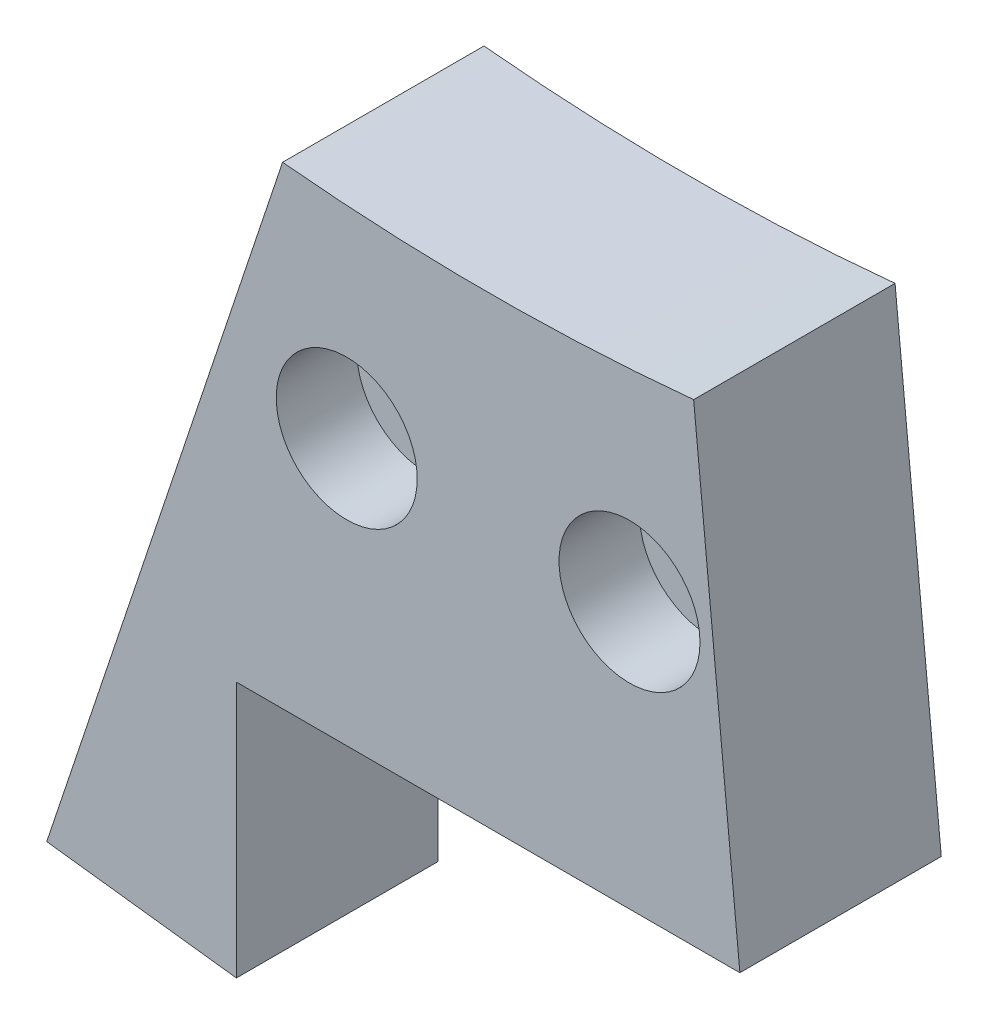
ISO-10303-21;
HEADER;
FILE_DESCRIPTION(('STEP AP214'),'2;1');
FILE_NAME('part.step','',(''),(''),'','','');
FILE_SCHEMA(('AUTOMOTIVE_DESIGN { 1 0 10303 214 1 1 1 1 }'));
ENDSEC;
DATA;
#1=APPLICATION_CONTEXT('core data for automotive mechanical design processes');
#2=APPLICATION_PROTOCOL_DEFINITION('international standard','automotive_design',2000,#1);
#3=PRODUCT_CONTEXT('',#1,'mechanical');
#4=PRODUCT('Part','Part','',(#3));
#5=PRODUCT_RELATED_PRODUCT_CATEGORY('part','',(#4));
#6=PRODUCT_DEFINITION_FORMATION('','',#4);
#7=PRODUCT_DEFINITION_CONTEXT('part definition',#1,'design');
#8=PRODUCT_DEFINITION('design','',#6,#7);
#9=PRODUCT_DEFINITION_SHAPE('','',#8);
#10=(LENGTH_UNIT() NAMED_UNIT(*) SI_UNIT(.MILLI.,.METRE.));
#11=(NAMED_UNIT(*) PLANE_ANGLE_UNIT() SI_UNIT($,.RADIAN.));
#12=(NAMED_UNIT(*) SI_UNIT($,.STERADIAN.) SOLID_ANGLE_UNIT());
#13=UNCERTAINTY_MEASURE_WITH_UNIT(LENGTH_MEASURE(1.E-05),#10,'distance_accuracy_value','');
#14=(GEOMETRIC_REPRESENTATION_CONTEXT(3) GLOBAL_UNCERTAINTY_ASSIGNED_CONTEXT((#13)) GLOBAL_UNIT_ASSIGNED_CONTEXT((#10,
#11,#12)) REPRESENTATION_CONTEXT('',''));
#15=CARTESIAN_POINT('',(0.,0.,0.));
#16=DIRECTION('',(0.,0.,1.));
#17=DIRECTION('',(1.,0.,0.));
#18=AXIS2_PLACEMENT_3D('',#15,#16,#17);
#19=CARTESIAN_POINT('',(7.02058204650813,-114.785501818515,-0.000999999999999265));
#20=DIRECTION('',(0.,0.,1.));
#21=DIRECTION('',(1.,0.,0.));
#22=AXIS2_PLACEMENT_3D('',#19,#20,#21);
#23=CYLINDRICAL_SURFACE('',#22,1.75);
#24=CARTESIAN_POINT('',(7.02058204650813,-114.785501818515,0.));
#25=DIRECTION('',(0.,0.,-1.));
#26=DIRECTION('',(-1.,0.,0.));
#27=AXIS2_PLACEMENT_3D('',#24,#25,#26);
#28=CIRCLE('',#27,1.75);
#29=CARTESIAN_POINT('',(5.27058204650813,-114.785501818515,0.));
#30=VERTEX_POINT('',#29);
#31=EDGE_CURVE('E176',#30,#30,#28,.F.);
#32=ORIENTED_EDGE('',*,*,#31,.F.);
#33=EDGE_LOOP('',(#32));
#34=FACE_BOUND('',#33,.T.);
#35=CARTESIAN_POINT('',(7.02058204650813,-114.785501818515,6.));
#36=DIRECTION('',(0.,0.,1.));
#37=DIRECTION('',(1.,0.,0.));
#38=AXIS2_PLACEMENT_3D('',#35,#36,#37);
#39=CIRCLE('',#38,1.75);
#40=CARTESIAN_POINT('',(8.77058204650814,-114.785501818515,6.));
#41=VERTEX_POINT('',#40);
#42=EDGE_CURVE('E152',#41,#41,#39,.F.);
#43=ORIENTED_EDGE('',*,*,#42,.F.);
#44=EDGE_LOOP('',(#43));
#45=FACE_BOUND('',#44,.T.);
#46=ADVANCED_FACE('F39',(#34,#45),#23,.F.);
#47=CARTESIAN_POINT('',(-7.02058204650813,-114.785501818515,-0.000999999999999265));
#48=DIRECTION('',(0.,0.,1.));
#49=DIRECTION('',(1.,0.,0.));
#50=AXIS2_PLACEMENT_3D('',#47,#48,#49);
#51=CYLINDRICAL_SURFACE('',#50,1.75);
#52=CARTESIAN_POINT('',(-7.02058204650813,-114.785501818515,0.));
#53=DIRECTION('',(0.,0.,-1.));
#54=DIRECTION('',(-1.,0.,0.));
#55=AXIS2_PLACEMENT_3D('',#52,#53,#54);
#56=CIRCLE('',#55,1.75);
#57=CARTESIAN_POINT('',(-8.77058204650813,-114.785501818515,0.));
#58=VERTEX_POINT('',#57);
#59=EDGE_CURVE('E171',#58,#58,#56,.F.);
#60=ORIENTED_EDGE('',*,*,#59,.F.);
#61=EDGE_LOOP('',(#60));
#62=FACE_BOUND('',#61,.T.);
#63=CARTESIAN_POINT('',(-7.02058204650813,-114.785501818515,6.));
#64=DIRECTION('',(0.,0.,1.));
#65=DIRECTION('',(1.,0.,0.));
#66=AXIS2_PLACEMENT_3D('',#63,#64,#65);
#67=CIRCLE('',#66,1.75);
#68=CARTESIAN_POINT('',(-5.27058204650813,-114.785501818515,6.));
#69=VERTEX_POINT('',#68);
#70=EDGE_CURVE('E43',#69,#69,#67,.F.);
#71=ORIENTED_EDGE('',*,*,#70,.F.);
#72=EDGE_LOOP('',(#71));
#73=FACE_BOUND('',#72,.T.);
#74=ADVANCED_FACE('F233',(#62,#73),#51,.F.);
#75=CARTESIAN_POINT('',(0.,0.,10.));
#76=DIRECTION('',(0.,0.,-1.));
#77=DIRECTION('',(-1.,0.,0.));
#78=AXIS2_PLACEMENT_3D('',#75,#76,#77);
#79=CYLINDRICAL_SURFACE('',#78,105.);
#80=CARTESIAN_POINT('',(0.,0.,0.));
#81=DIRECTION('',(0.,0.,-1.));
#82=DIRECTION('',(-1.,0.,0.));
#83=AXIS2_PLACEMENT_3D('',#80,#81,#82);
#84=CIRCLE('',#83,105.);
#85=CARTESIAN_POINT('',(10.2053587787538,-104.502873894438,0.));
#86=VERTEX_POINT('',#85);
#87=CARTESIAN_POINT('',(-10.2053587787537,-104.502873894438,0.));
#88=VERTEX_POINT('',#87);
#89=EDGE_CURVE('E109',#86,#88,#84,.T.);
#90=ORIENTED_EDGE('',*,*,#89,.T.);
#91=DIRECTION('',(0.,0.,-1.));
#92=VECTOR('',#91,1.);
#93=CARTESIAN_POINT('',(-10.2053587787537,-104.502873894438,10.));
#94=LINE('',#93,#92);
#95=CARTESIAN_POINT('',(-10.2053587787537,-104.502873894438,10.));
#96=VERTEX_POINT('',#95);
#97=EDGE_CURVE('E11',#96,#88,#94,.T.);
#98=ORIENTED_EDGE('',*,*,#97,.F.);
#99=CARTESIAN_POINT('',(0.,0.,10.));
#100=DIRECTION('',(0.,0.,-1.));
#101=DIRECTION('',(-1.,0.,0.));
#102=AXIS2_PLACEMENT_3D('',#99,#100,#101);
#103=CIRCLE('',#102,105.);
#104=CARTESIAN_POINT('',(10.2053587787538,-104.502873894438,10.));
#105=VERTEX_POINT('',#104);
#106=EDGE_CURVE('E84',#105,#96,#103,.T.);
#107=ORIENTED_EDGE('',*,*,#106,.F.);
#108=DIRECTION('',(0.,0.,-1.));
#109=VECTOR('',#108,1.);
#110=CARTESIAN_POINT('',(10.2053587787538,-104.502873894438,10.));
#111=LINE('',#110,#109);
#112=EDGE_CURVE('E201',#105,#86,#111,.T.);
#113=ORIENTED_EDGE('',*,*,#112,.T.);
#114=EDGE_LOOP('',(#90,#98,#107,#113));
#115=FACE_BOUND('',#114,.T.);
#116=ADVANCED_FACE('F41',(#115),#79,.F.);
#117=CARTESIAN_POINT('',(-12.5,-128.,10.));
#118=DIRECTION('',(0.,1.,0.));
#119=DIRECTION('',(0.,0.,1.));
#120=AXIS2_PLACEMENT_3D('',#117,#118,#119);
#121=PLANE('',#120);
#122=CARTESIAN_POINT('',(-4.75,-128.,6.));
#123=DIRECTION('',(0.,-1.,0.));
#124=DIRECTION('',(1.,0.,0.));
#125=AXIS2_PLACEMENT_3D('',#122,#123,#124);
#126=CIRCLE('',#125,1.025);
#127=CARTESIAN_POINT('',(-3.725,-128.,6.));
#128=VERTEX_POINT('',#127);
#129=EDGE_CURVE('E184',#128,#128,#126,.T.);
#130=ORIENTED_EDGE('',*,*,#129,.F.);
#131=EDGE_LOOP('',(#130));
#132=FACE_BOUND('',#131,.T.);
#133=CARTESIAN_POINT('',(4.75,-128.,6.));
#134=DIRECTION('',(0.,-1.,0.));
#135=DIRECTION('',(1.,0.,0.));
#136=AXIS2_PLACEMENT_3D('',#133,#134,#135);
#137=CIRCLE('',#136,1.025);
#138=CARTESIAN_POINT('',(5.775,-128.,6.));
#139=VERTEX_POINT('',#138);
#140=EDGE_CURVE('E175',#139,#139,#137,.T.);
#141=ORIENTED_EDGE('',*,*,#140,.F.);
#142=EDGE_LOOP('',(#141));
#143=FACE_BOUND('',#142,.T.);
#144=DIRECTION('',(1.,0.,0.));
#145=VECTOR('',#144,1.);
#146=CARTESIAN_POINT('',(-12.5,-128.,0.));
#147=LINE('',#146,#145);
#148=CARTESIAN_POINT('',(-12.5,-128.,0.));
#149=VERTEX_POINT('',#148);
#150=CARTESIAN_POINT('',(12.5,-128.,0.));
#151=VERTEX_POINT('',#150);
#152=EDGE_CURVE('E73',#149,#151,#147,.T.);
#153=ORIENTED_EDGE('',*,*,#152,.T.);
#154=DIRECTION('',(0.,0.,-1.));
#155=VECTOR('',#154,1.);
#156=CARTESIAN_POINT('',(12.5,-128.,10.));
#157=LINE('',#156,#155);
#158=CARTESIAN_POINT('',(12.5,-128.,10.));
#159=VERTEX_POINT('',#158);
#160=EDGE_CURVE('E118',#159,#151,#157,.T.);
#161=ORIENTED_EDGE('',*,*,#160,.F.);
#162=DIRECTION('',(1.,0.,0.));
#163=VECTOR('',#162,1.);
#164=CARTESIAN_POINT('',(-12.5,-128.,10.));
#165=LINE('',#164,#163);
#166=CARTESIAN_POINT('',(-12.5,-128.,10.));
#167=VERTEX_POINT('',#166);
#168=EDGE_CURVE('E113',#167,#159,#165,.T.);
#169=ORIENTED_EDGE('',*,*,#168,.F.);
#170=DIRECTION('',(0.,0.,-1.));
#171=VECTOR('',#170,1.);
#172=CARTESIAN_POINT('',(-12.5,-128.,10.));
#173=LINE('',#172,#171);
#174=EDGE_CURVE('E50',#167,#149,#173,.T.);
#175=ORIENTED_EDGE('',*,*,#174,.T.);
#176=EDGE_LOOP('',(#153,#161,#169,#175));
#177=FACE_BOUND('',#176,.T.);
#178=ADVANCED_FACE('F112',(#132,#143,#177),#121,.F.);
#179=CARTESIAN_POINT('',(10.2053587787538,-104.502873894438,10.));
#180=DIRECTION('',(-0.995265465661319,-0.0971938931309882,0.));
#181=DIRECTION('',(0.0971938931309882,-0.995265465661319,0.));
#182=AXIS2_PLACEMENT_3D('',#179,#180,#181);
#183=PLANE('',#182);
#184=DIRECTION('',(-0.0971938931309882,0.995265465661319,0.));
#185=VECTOR('',#184,1.);
#186=CARTESIAN_POINT('',(10.2053587787538,-104.502873894438,0.));
#187=LINE('',#186,#185);
#188=EDGE_CURVE('E79',#151,#86,#187,.T.);
#189=ORIENTED_EDGE('',*,*,#188,.T.);
#190=ORIENTED_EDGE('',*,*,#112,.F.);
#191=DIRECTION('',(-0.0971938931309882,0.995265465661319,0.));
#192=VECTOR('',#191,1.);
#193=CARTESIAN_POINT('',(10.2053587787538,-104.502873894438,10.));
#194=LINE('',#193,#192);
#195=EDGE_CURVE('E58',#159,#105,#194,.T.);
#196=ORIENTED_EDGE('',*,*,#195,.F.);
#197=ORIENTED_EDGE('',*,*,#160,.T.);
#198=EDGE_LOOP('',(#189,#190,#196,#197));
#199=FACE_BOUND('',#198,.T.);
#200=ADVANCED_FACE('F209',(#199),#183,.F.);
#201=CARTESIAN_POINT('',(0.,0.,10.));
#202=DIRECTION('',(0.,0.,-1.));
#203=DIRECTION('',(-1.,0.,0.));
#204=AXIS2_PLACEMENT_3D('',#201,#202,#203);
#205=PLANE('',#204);
#206=CARTESIAN_POINT('',(7.02058204650813,-114.785501818515,10.));
#207=DIRECTION('',(0.,0.,1.));
#208=DIRECTION('',(1.,0.,0.));
#209=AXIS2_PLACEMENT_3D('',#206,#207,#208);
#210=CIRCLE('',#209,3.5);
#211=CARTESIAN_POINT('',(10.5205820465081,-114.785501818515,10.));
#212=VERTEX_POINT('',#211);
#213=EDGE_CURVE('E157',#212,#212,#210,.T.);
#214=ORIENTED_EDGE('',*,*,#213,.F.);
#215=EDGE_LOOP('',(#214));
#216=FACE_BOUND('',#215,.T.);
#217=CARTESIAN_POINT('',(-7.02058204650813,-114.785501818515,10.));
#218=DIRECTION('',(0.,0.,1.));
#219=DIRECTION('',(1.,0.,0.));
#220=AXIS2_PLACEMENT_3D('',#217,#218,#219);
#221=CIRCLE('',#220,3.5);
#222=CARTESIAN_POINT('',(-3.52058204650813,-114.785501818515,10.));
#223=VERTEX_POINT('',#222);
#224=EDGE_CURVE('E164',#223,#223,#221,.T.);
#225=ORIENTED_EDGE('',*,*,#224,.F.);
#226=EDGE_LOOP('',(#225));
#227=FACE_BOUND('',#226,.T.);
#228=ORIENTED_EDGE('',*,*,#106,.T.);
#229=DIRECTION('',(-0.316755593018876,-0.948507192535334,0.));
#230=VECTOR('',#229,1.);
#231=CARTESIAN_POINT('',(-21.9159025776117,-139.569452880007,10.));
#232=LINE('',#231,#230);
#233=CARTESIAN_POINT('',(-21.9159025776117,-139.569452880007,10.));
#234=VERTEX_POINT('',#233);
#235=EDGE_CURVE('E132',#96,#234,#232,.T.);
#236=ORIENTED_EDGE('',*,*,#235,.T.);
#237=DIRECTION('',(0.992546151641323,-0.121869343405141,0.));
#238=VECTOR('',#237,1.);
#239=CARTESIAN_POINT('',(-12.5,-140.725580343503,10.));
#240=LINE('',#239,#238);
#241=CARTESIAN_POINT('',(-12.5,-140.725580343503,10.));
#242=VERTEX_POINT('',#241);
#243=EDGE_CURVE('E124',#234,#242,#240,.T.);
#244=ORIENTED_EDGE('',*,*,#243,.T.);
#245=DIRECTION('',(0.,1.,0.));
#246=VECTOR('',#245,1.);
#247=CARTESIAN_POINT('',(-12.5,-140.725580343503,10.));
#248=LINE('',#247,#246);
#249=EDGE_CURVE('E141',#242,#167,#248,.T.);
#250=ORIENTED_EDGE('',*,*,#249,.T.);
#251=ORIENTED_EDGE('',*,*,#168,.T.);
#252=ORIENTED_EDGE('',*,*,#195,.T.);
#253=EDGE_LOOP('',(#228,#236,#244,#250,#251,#252));
#254=FACE_BOUND('',#253,.T.);
#255=ADVANCED_FACE('F216',(#216,#227,#254),#205,.F.);
#256=CARTESIAN_POINT('',(0.,0.,0.));
#257=DIRECTION('',(0.,0.,-1.));
#258=DIRECTION('',(-1.,0.,0.));
#259=AXIS2_PLACEMENT_3D('',#256,#257,#258);
#260=PLANE('',#259);
#261=ORIENTED_EDGE('',*,*,#59,.T.);
#262=EDGE_LOOP('',(#261));
#263=FACE_BOUND('',#262,.T.);
#264=ORIENTED_EDGE('',*,*,#31,.T.);
#265=EDGE_LOOP('',(#264));
#266=FACE_BOUND('',#265,.T.);
#267=ORIENTED_EDGE('',*,*,#89,.F.);
#268=ORIENTED_EDGE('',*,*,#188,.F.);
#269=ORIENTED_EDGE('',*,*,#152,.F.);
#270=DIRECTION('',(0.,1.,0.));
#271=VECTOR('',#270,1.);
#272=CARTESIAN_POINT('',(-12.5,-140.725580343503,0.));
#273=LINE('',#272,#271);
#274=CARTESIAN_POINT('',(-12.5,-140.725580343503,0.));
#275=VERTEX_POINT('',#274);
#276=EDGE_CURVE('E106',#275,#149,#273,.T.);
#277=ORIENTED_EDGE('',*,*,#276,.F.);
#278=DIRECTION('',(0.992546151641323,-0.121869343405141,0.));
#279=VECTOR('',#278,1.);
#280=CARTESIAN_POINT('',(-12.5,-140.725580343503,0.));
#281=LINE('',#280,#279);
#282=CARTESIAN_POINT('',(-21.9159025776117,-139.569452880007,0.));
#283=VERTEX_POINT('',#282);
#284=EDGE_CURVE('E129',#283,#275,#281,.T.);
#285=ORIENTED_EDGE('',*,*,#284,.F.);
#286=DIRECTION('',(-0.316755593018876,-0.948507192535334,0.));
#287=VECTOR('',#286,1.);
#288=CARTESIAN_POINT('',(-21.9159025776117,-139.569452880007,0.));
#289=LINE('',#288,#287);
#290=EDGE_CURVE('E123',#88,#283,#289,.T.);
#291=ORIENTED_EDGE('',*,*,#290,.F.);
#292=EDGE_LOOP('',(#267,#268,#269,#277,#285,#291));
#293=FACE_BOUND('',#292,.T.);
#294=ADVANCED_FACE('F103',(#263,#266,#293),#260,.T.);
#295=CARTESIAN_POINT('',(4.75,-120.,6.));
#296=DIRECTION('',(0.,-1.,0.));
#297=DIRECTION('',(1.,0.,0.));
#298=AXIS2_PLACEMENT_3D('',#295,#296,#297);
#299=CYLINDRICAL_SURFACE('',#298,1.025);
#300=CARTESIAN_POINT('',(4.75,-120.,6.));
#301=DIRECTION('',(0.,-1.,0.));
#302=DIRECTION('',(1.,0.,0.));
#303=AXIS2_PLACEMENT_3D('',#300,#301,#302);
#304=CIRCLE('',#303,1.025);
#305=CARTESIAN_POINT('',(5.775,-120.,6.));
#306=VERTEX_POINT('',#305);
#307=EDGE_CURVE('E188',#306,#306,#304,.T.);
#308=ORIENTED_EDGE('',*,*,#307,.F.);
#309=EDGE_LOOP('',(#308));
#310=FACE_BOUND('',#309,.T.);
#311=ORIENTED_EDGE('',*,*,#140,.T.);
#312=EDGE_LOOP('',(#311));
#313=FACE_BOUND('',#312,.T.);
#314=ADVANCED_FACE('F257',(#310,#313),#299,.F.);
#315=CARTESIAN_POINT('',(4.75,-120.,6.));
#316=DIRECTION('',(0.,-1.,0.));
#317=DIRECTION('',(1.,0.,0.));
#318=AXIS2_PLACEMENT_3D('',#315,#316,#317);
#319=PLANE('',#318);
#320=ORIENTED_EDGE('',*,*,#307,.T.);
#321=EDGE_LOOP('',(#320));
#322=FACE_BOUND('',#321,.T.);
#323=ADVANCED_FACE('F253',(#322),#319,.T.);
#324=CARTESIAN_POINT('',(-4.75,-120.,6.));
#325=DIRECTION('',(0.,-1.,0.));
#326=DIRECTION('',(1.,0.,0.));
#327=AXIS2_PLACEMENT_3D('',#324,#325,#326);
#328=CYLINDRICAL_SURFACE('',#327,1.025);
#329=CARTESIAN_POINT('',(-4.75,-120.,6.));
#330=DIRECTION('',(0.,-1.,0.));
#331=DIRECTION('',(1.,0.,0.));
#332=AXIS2_PLACEMENT_3D('',#329,#330,#331);
#333=CIRCLE('',#332,1.025);
#334=CARTESIAN_POINT('',(-3.725,-120.,6.));
#335=VERTEX_POINT('',#334);
#336=EDGE_CURVE('E180',#335,#335,#333,.T.);
#337=ORIENTED_EDGE('',*,*,#336,.F.);
#338=EDGE_LOOP('',(#337));
#339=FACE_BOUND('',#338,.T.);
#340=ORIENTED_EDGE('',*,*,#129,.T.);
#341=EDGE_LOOP('',(#340));
#342=FACE_BOUND('',#341,.T.);
#343=ADVANCED_FACE('F249',(#339,#342),#328,.F.);
#344=CARTESIAN_POINT('',(-4.75,-120.,6.));
#345=DIRECTION('',(0.,-1.,0.));
#346=DIRECTION('',(1.,0.,0.));
#347=AXIS2_PLACEMENT_3D('',#344,#345,#346);
#348=PLANE('',#347);
#349=ORIENTED_EDGE('',*,*,#336,.T.);
#350=EDGE_LOOP('',(#349));
#351=FACE_BOUND('',#350,.T.);
#352=ADVANCED_FACE('F245',(#351),#348,.T.);
#353=CARTESIAN_POINT('',(-7.02058204650813,-114.785501818515,6.));
#354=DIRECTION('',(0.,0.,1.));
#355=DIRECTION('',(1.,0.,0.));
#356=AXIS2_PLACEMENT_3D('',#353,#354,#355);
#357=PLANE('',#356);
#358=CARTESIAN_POINT('',(-7.02058204650813,-114.785501818515,6.));
#359=DIRECTION('',(0.,0.,1.));
#360=DIRECTION('',(1.,0.,0.));
#361=AXIS2_PLACEMENT_3D('',#358,#359,#360);
#362=CIRCLE('',#361,3.5);
#363=CARTESIAN_POINT('',(-3.52058204650813,-114.785501818515,6.));
#364=VERTEX_POINT('',#363);
#365=EDGE_CURVE('E149',#364,#364,#362,.T.);
#366=ORIENTED_EDGE('',*,*,#365,.T.);
#367=EDGE_LOOP('',(#366));
#368=FACE_BOUND('',#367,.T.);
#369=ORIENTED_EDGE('',*,*,#70,.T.);
#370=EDGE_LOOP('',(#369));
#371=FACE_BOUND('',#370,.T.);
#372=ADVANCED_FACE('F248',(#368,#371),#357,.T.);
#373=CARTESIAN_POINT('',(-7.02058204650813,-114.785501818515,6.));
#374=DIRECTION('',(0.,0.,1.));
#375=DIRECTION('',(1.,0.,0.));
#376=AXIS2_PLACEMENT_3D('',#373,#374,#375);
#377=CYLINDRICAL_SURFACE('',#376,3.5);
#378=ORIENTED_EDGE('',*,*,#365,.F.);
#379=EDGE_LOOP('',(#378));
#380=FACE_BOUND('',#379,.T.);
#381=ORIENTED_EDGE('',*,*,#224,.T.);
#382=EDGE_LOOP('',(#381));
#383=FACE_BOUND('',#382,.T.);
#384=ADVANCED_FACE('F300',(#380,#383),#377,.F.);
#385=CARTESIAN_POINT('',(7.02058204650813,-114.785501818515,6.));
#386=DIRECTION('',(0.,0.,1.));
#387=DIRECTION('',(1.,0.,0.));
#388=AXIS2_PLACEMENT_3D('',#385,#386,#387);
#389=CYLINDRICAL_SURFACE('',#388,3.5);
#390=CARTESIAN_POINT('',(7.02058204650813,-114.785501818515,6.));
#391=DIRECTION('',(0.,0.,1.));
#392=DIRECTION('',(1.,0.,0.));
#393=AXIS2_PLACEMENT_3D('',#390,#391,#392);
#394=CIRCLE('',#393,3.5);
#395=CARTESIAN_POINT('',(10.5205820465081,-114.785501818515,6.));
#396=VERTEX_POINT('',#395);
#397=EDGE_CURVE('E156',#396,#396,#394,.T.);
#398=ORIENTED_EDGE('',*,*,#397,.F.);
#399=EDGE_LOOP('',(#398));
#400=FACE_BOUND('',#399,.T.);
#401=ORIENTED_EDGE('',*,*,#213,.T.);
#402=EDGE_LOOP('',(#401));
#403=FACE_BOUND('',#402,.T.);
#404=ADVANCED_FACE('F289',(#400,#403),#389,.F.);
#405=CARTESIAN_POINT('',(0.,0.,6.));
#406=DIRECTION('',(0.,0.,1.));
#407=DIRECTION('',(1.,0.,0.));
#408=AXIS2_PLACEMENT_3D('',#405,#406,#407);
#409=PLANE('',#408);
#410=ORIENTED_EDGE('',*,*,#42,.T.);
#411=EDGE_LOOP('',(#410));
#412=FACE_BOUND('',#411,.T.);
#413=ORIENTED_EDGE('',*,*,#397,.T.);
#414=EDGE_LOOP('',(#413));
#415=FACE_BOUND('',#414,.T.);
#416=ADVANCED_FACE('F228',(#412,#415),#409,.T.);
#417=CARTESIAN_POINT('',(-12.5,-140.725580343503,0.));
#418=DIRECTION('',(1.,0.,0.));
#419=DIRECTION('',(0.,1.,0.));
#420=AXIS2_PLACEMENT_3D('',#417,#418,#419);
#421=PLANE('',#420);
#422=ORIENTED_EDGE('',*,*,#249,.F.);
#423=DIRECTION('',(0.,0.,1.));
#424=VECTOR('',#423,1.);
#425=CARTESIAN_POINT('',(-12.5,-140.725580343503,0.));
#426=LINE('',#425,#424);
#427=EDGE_CURVE('E121',#275,#242,#426,.T.);
#428=ORIENTED_EDGE('',*,*,#427,.F.);
#429=ORIENTED_EDGE('',*,*,#276,.T.);
#430=ORIENTED_EDGE('',*,*,#174,.F.);
#431=EDGE_LOOP('',(#422,#428,#429,#430));
#432=FACE_BOUND('',#431,.T.);
#433=ADVANCED_FACE('F120',(#432),#421,.T.);
#434=CARTESIAN_POINT('',(-12.5,-140.725580343503,0.));
#435=DIRECTION('',(-0.121869343405141,-0.992546151641323,0.));
#436=DIRECTION('',(0.992546151641323,-0.121869343405141,0.));
#437=AXIS2_PLACEMENT_3D('',#434,#435,#436);
#438=PLANE('',#437);
#439=CARTESIAN_POINT('',(-17.2079512888059,-140.147516611755,5.));
#440=DIRECTION('',(-0.12186934340514,-0.992546151641323,0.));
#441=DIRECTION('',(0.992546151641323,-0.12186934340514,0.));
#442=AXIS2_PLACEMENT_3D('',#439,#440,#441);
#443=CIRCLE('',#442,2.75000000000008);
#444=CARTESIAN_POINT('',(-14.4784493717922,-140.482657306119,5.));
#445=VERTEX_POINT('',#444);
#446=EDGE_CURVE('E135',#445,#445,#443,.T.);
#447=ORIENTED_EDGE('',*,*,#446,.F.);
#448=EDGE_LOOP('',(#447));
#449=FACE_BOUND('',#448,.T.);
#450=ORIENTED_EDGE('',*,*,#243,.F.);
#451=DIRECTION('',(0.,0.,1.));
#452=VECTOR('',#451,1.);
#453=CARTESIAN_POINT('',(-21.9159025776117,-139.569452880007,0.));
#454=LINE('',#453,#452);
#455=EDGE_CURVE('E140',#283,#234,#454,.T.);
#456=ORIENTED_EDGE('',*,*,#455,.F.);
#457=ORIENTED_EDGE('',*,*,#284,.T.);
#458=ORIENTED_EDGE('',*,*,#427,.T.);
#459=EDGE_LOOP('',(#450,#456,#457,#458));
#460=FACE_BOUND('',#459,.T.);
#461=ADVANCED_FACE('F218',(#449,#460),#438,.T.);
#462=CARTESIAN_POINT('',(-21.9159025776117,-139.569452880007,0.));
#463=DIRECTION('',(-0.948507192535334,0.316755593018876,0.));
#464=DIRECTION('',(-0.316755593018876,-0.948507192535334,0.));
#465=AXIS2_PLACEMENT_3D('',#462,#463,#464);
#466=PLANE('',#465);
#467=ORIENTED_EDGE('',*,*,#235,.F.);
#468=ORIENTED_EDGE('',*,*,#97,.T.);
#469=ORIENTED_EDGE('',*,*,#290,.T.);
#470=ORIENTED_EDGE('',*,*,#455,.T.);
#471=EDGE_LOOP('',(#467,#468,#469,#470));
#472=FACE_BOUND('',#471,.T.);
#473=ADVANCED_FACE('F214',(#472),#466,.T.);
#474=CARTESIAN_POINT('',(-16.9642126019956,-138.162424308472,5.));
#475=DIRECTION('',(-0.12186934340514,-0.992546151641323,0.));
#476=DIRECTION('',(0.992546151641323,-0.12186934340514,0.));
#477=AXIS2_PLACEMENT_3D('',#474,#475,#476);
#478=CYLINDRICAL_SURFACE('',#477,2.75000000000008);
#479=CARTESIAN_POINT('',(-16.9642126019956,-138.162424308472,5.));
#480=DIRECTION('',(-0.12186934340514,-0.992546151641323,0.));
#481=DIRECTION('',(0.992546151641323,-0.12186934340514,0.));
#482=AXIS2_PLACEMENT_3D('',#479,#480,#481);
#483=CIRCLE('',#482,2.75000000000008);
#484=CARTESIAN_POINT('',(-14.2347106849819,-138.497565002836,5.));
#485=VERTEX_POINT('',#484);
#486=EDGE_CURVE('E144',#485,#485,#483,.T.);
#487=ORIENTED_EDGE('',*,*,#486,.F.);
#488=EDGE_LOOP('',(#487));
#489=FACE_BOUND('',#488,.T.);
#490=ORIENTED_EDGE('',*,*,#446,.T.);
#491=EDGE_LOOP('',(#490));
#492=FACE_BOUND('',#491,.T.);
#493=ADVANCED_FACE('F226',(#489,#492),#478,.F.);
#494=CARTESIAN_POINT('',(-16.9642126019956,-138.162424308472,5.));
#495=DIRECTION('',(-0.12186934340514,-0.992546151641323,0.));
#496=DIRECTION('',(0.992546151641323,-0.12186934340514,0.));
#497=AXIS2_PLACEMENT_3D('',#494,#495,#496);
#498=PLANE('',#497);
#499=ORIENTED_EDGE('',*,*,#486,.T.);
#500=EDGE_LOOP('',(#499));
#501=FACE_BOUND('',#500,.T.);
#502=ADVANCED_FACE('F401',(#501),#498,.T.);
#503=CLOSED_SHELL('',(#46,#74,#116,#178,#200,#255,#294,#314,#323,#343,#352,#372,#384,#404,#416,
#433,#461,#473,#493,#502));
#504=MANIFOLD_SOLID_BREP('B2',#503);
#505=ADVANCED_BREP_SHAPE_REPRESENTATION('',(#18,#504),#14);
#506=SHAPE_DEFINITION_REPRESENTATION(#9,#505);
ENDSEC;
END-ISO-10303-21;
